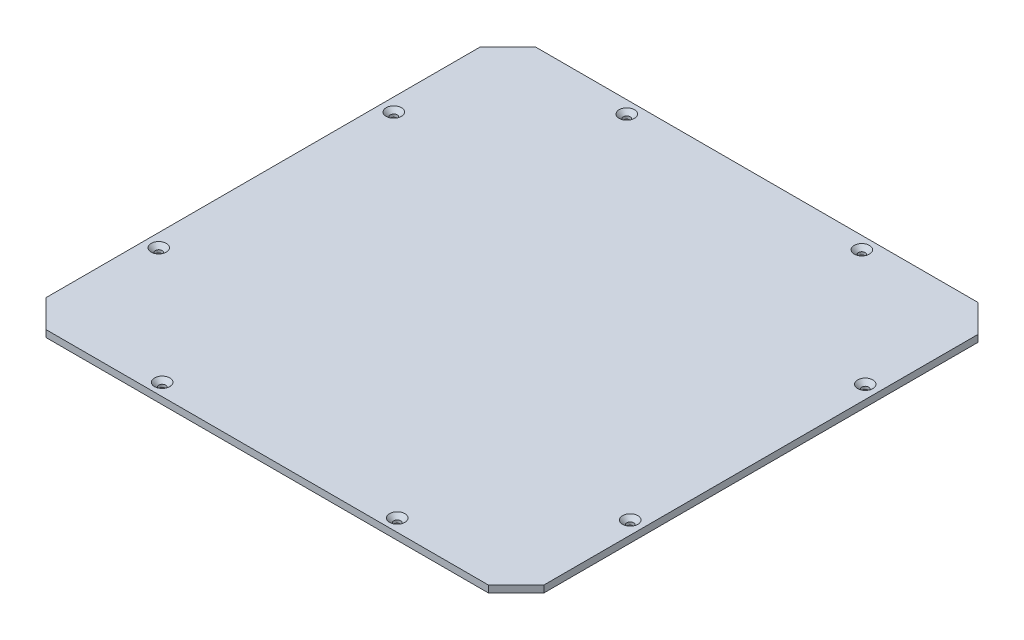
ISO-10303-21;
HEADER;
FILE_DESCRIPTION(('STEP AP214'),'2;1');
FILE_NAME('part.step','',(''),(''),'','','');
FILE_SCHEMA(('AUTOMOTIVE_DESIGN { 1 0 10303 214 1 1 1 1 }'));
ENDSEC;
DATA;
#1=APPLICATION_CONTEXT('core data for automotive mechanical design processes');
#2=APPLICATION_PROTOCOL_DEFINITION('international standard','automotive_design',2000,#1);
#3=PRODUCT_CONTEXT('',#1,'mechanical');
#4=PRODUCT('Part','Part','',(#3));
#5=PRODUCT_RELATED_PRODUCT_CATEGORY('part','',(#4));
#6=PRODUCT_DEFINITION_FORMATION('','',#4);
#7=PRODUCT_DEFINITION_CONTEXT('part definition',#1,'design');
#8=PRODUCT_DEFINITION('design','',#6,#7);
#9=PRODUCT_DEFINITION_SHAPE('','',#8);
#10=(LENGTH_UNIT() NAMED_UNIT(*) SI_UNIT(.MILLI.,.METRE.));
#11=(NAMED_UNIT(*) PLANE_ANGLE_UNIT() SI_UNIT($,.RADIAN.));
#12=(NAMED_UNIT(*) SI_UNIT($,.STERADIAN.) SOLID_ANGLE_UNIT());
#13=UNCERTAINTY_MEASURE_WITH_UNIT(LENGTH_MEASURE(1.E-05),#10,'distance_accuracy_value','');
#14=(GEOMETRIC_REPRESENTATION_CONTEXT(3) GLOBAL_UNCERTAINTY_ASSIGNED_CONTEXT((#13)) GLOBAL_UNIT_ASSIGNED_CONTEXT((#10,
#11,#12)) REPRESENTATION_CONTEXT('',''));
#15=CARTESIAN_POINT('',(0.,0.,0.));
#16=DIRECTION('',(0.,0.,1.));
#17=DIRECTION('',(1.,0.,0.));
#18=AXIS2_PLACEMENT_3D('',#15,#16,#17);
#19=CARTESIAN_POINT('',(-180.,5.,-177.));
#20=DIRECTION('',(1.,0.,0.));
#21=DIRECTION('',(0.,0.,-1.));
#22=AXIS2_PLACEMENT_3D('',#19,#20,#21);
#23=PLANE('',#22);
#24=DIRECTION('',(0.,0.,1.));
#25=VECTOR('',#24,1.);
#26=CARTESIAN_POINT('',(-180.,5.,-177.));
#27=LINE('',#26,#25);
#28=CARTESIAN_POINT('',(-180.,5.,-157.));
#29=VERTEX_POINT('',#28);
#30=CARTESIAN_POINT('',(-180.,5.,157.));
#31=VERTEX_POINT('',#30);
#32=EDGE_CURVE('E128',#29,#31,#27,.T.);
#33=ORIENTED_EDGE('',*,*,#32,.F.);
#34=DIRECTION('',(0.,-1.,0.));
#35=VECTOR('',#34,1.);
#36=CARTESIAN_POINT('',(-180.,5.,-157.));
#37=LINE('',#36,#35);
#38=CARTESIAN_POINT('',(-180.,0.,-157.));
#39=VERTEX_POINT('',#38);
#40=EDGE_CURVE('E154',#29,#39,#37,.T.);
#41=ORIENTED_EDGE('',*,*,#40,.T.);
#42=DIRECTION('',(0.,0.,1.));
#43=VECTOR('',#42,1.);
#44=CARTESIAN_POINT('',(-180.,0.,-177.));
#45=LINE('',#44,#43);
#46=CARTESIAN_POINT('',(-180.,0.,157.));
#47=VERTEX_POINT('',#46);
#48=EDGE_CURVE('E165',#39,#47,#45,.T.);
#49=ORIENTED_EDGE('',*,*,#48,.T.);
#50=DIRECTION('',(0.,1.,0.));
#51=VECTOR('',#50,1.);
#52=CARTESIAN_POINT('',(-180.,5.,157.));
#53=LINE('',#52,#51);
#54=EDGE_CURVE('E152',#47,#31,#53,.T.);
#55=ORIENTED_EDGE('',*,*,#54,.T.);
#56=EDGE_LOOP('',(#33,#41,#49,#55));
#57=FACE_BOUND('',#56,.T.);
#58=ADVANCED_FACE('F35',(#57),#23,.F.);
#59=CARTESIAN_POINT('',(180.,5.,177.));
#60=DIRECTION('',(0.,0.,-1.));
#61=DIRECTION('',(-1.,0.,0.));
#62=AXIS2_PLACEMENT_3D('',#59,#60,#61);
#63=PLANE('',#62);
#64=DIRECTION('',(1.,0.,0.));
#65=VECTOR('',#64,1.);
#66=CARTESIAN_POINT('',(180.,5.,177.));
#67=LINE('',#66,#65);
#68=CARTESIAN_POINT('',(-160.,5.,177.));
#69=VERTEX_POINT('',#68);
#70=CARTESIAN_POINT('',(160.,5.,177.));
#71=VERTEX_POINT('',#70);
#72=EDGE_CURVE('E131',#69,#71,#67,.T.);
#73=ORIENTED_EDGE('',*,*,#72,.F.);
#74=DIRECTION('',(0.,-1.,0.));
#75=VECTOR('',#74,1.);
#76=CARTESIAN_POINT('',(-160.,5.,177.));
#77=LINE('',#76,#75);
#78=CARTESIAN_POINT('',(-160.,0.,177.));
#79=VERTEX_POINT('',#78);
#80=EDGE_CURVE('E158',#69,#79,#77,.T.);
#81=ORIENTED_EDGE('',*,*,#80,.T.);
#82=DIRECTION('',(1.,0.,0.));
#83=VECTOR('',#82,1.);
#84=CARTESIAN_POINT('',(180.,0.,177.));
#85=LINE('',#84,#83);
#86=CARTESIAN_POINT('',(160.,0.,177.));
#87=VERTEX_POINT('',#86);
#88=EDGE_CURVE('E133',#79,#87,#85,.T.);
#89=ORIENTED_EDGE('',*,*,#88,.T.);
#90=DIRECTION('',(0.,1.,0.));
#91=VECTOR('',#90,1.);
#92=CARTESIAN_POINT('',(160.,5.,177.));
#93=LINE('',#92,#91);
#94=EDGE_CURVE('E50',#87,#71,#93,.T.);
#95=ORIENTED_EDGE('',*,*,#94,.T.);
#96=EDGE_LOOP('',(#73,#81,#89,#95));
#97=FACE_BOUND('',#96,.T.);
#98=ADVANCED_FACE('F247',(#97),#63,.F.);
#99=CARTESIAN_POINT('',(180.,5.,-177.));
#100=DIRECTION('',(-1.,0.,0.));
#101=DIRECTION('',(0.,0.,1.));
#102=AXIS2_PLACEMENT_3D('',#99,#100,#101);
#103=PLANE('',#102);
#104=DIRECTION('',(0.,0.,-1.));
#105=VECTOR('',#104,1.);
#106=CARTESIAN_POINT('',(180.,0.,-177.));
#107=LINE('',#106,#105);
#108=CARTESIAN_POINT('',(180.,0.,157.));
#109=VERTEX_POINT('',#108);
#110=CARTESIAN_POINT('',(180.,0.,-157.));
#111=VERTEX_POINT('',#110);
#112=EDGE_CURVE('E129',#109,#111,#107,.T.);
#113=ORIENTED_EDGE('',*,*,#112,.T.);
#114=DIRECTION('',(0.,1.,0.));
#115=VECTOR('',#114,1.);
#116=CARTESIAN_POINT('',(180.,5.,-157.));
#117=LINE('',#116,#115);
#118=CARTESIAN_POINT('',(180.,5.,-157.));
#119=VERTEX_POINT('',#118);
#120=EDGE_CURVE('E107',#111,#119,#117,.T.);
#121=ORIENTED_EDGE('',*,*,#120,.T.);
#122=DIRECTION('',(0.,0.,-1.));
#123=VECTOR('',#122,1.);
#124=CARTESIAN_POINT('',(180.,5.,-177.));
#125=LINE('',#124,#123);
#126=CARTESIAN_POINT('',(180.,5.,157.));
#127=VERTEX_POINT('',#126);
#128=EDGE_CURVE('E345',#127,#119,#125,.T.);
#129=ORIENTED_EDGE('',*,*,#128,.F.);
#130=DIRECTION('',(0.,-1.,0.));
#131=VECTOR('',#130,1.);
#132=CARTESIAN_POINT('',(180.,5.,157.));
#133=LINE('',#132,#131);
#134=EDGE_CURVE('E112',#127,#109,#133,.T.);
#135=ORIENTED_EDGE('',*,*,#134,.T.);
#136=EDGE_LOOP('',(#113,#121,#129,#135));
#137=FACE_BOUND('',#136,.T.);
#138=ADVANCED_FACE('F253',(#137),#103,.F.);
#139=CARTESIAN_POINT('',(180.,5.,-177.));
#140=DIRECTION('',(0.,0.,1.));
#141=DIRECTION('',(1.,0.,0.));
#142=AXIS2_PLACEMENT_3D('',#139,#140,#141);
#143=PLANE('',#142);
#144=DIRECTION('',(-1.,0.,0.));
#145=VECTOR('',#144,1.);
#146=CARTESIAN_POINT('',(180.,5.,-177.));
#147=LINE('',#146,#145);
#148=CARTESIAN_POINT('',(160.,5.,-177.));
#149=VERTEX_POINT('',#148);
#150=CARTESIAN_POINT('',(-160.,5.,-177.));
#151=VERTEX_POINT('',#150);
#152=EDGE_CURVE('E122',#149,#151,#147,.T.);
#153=ORIENTED_EDGE('',*,*,#152,.F.);
#154=DIRECTION('',(0.,-1.,0.));
#155=VECTOR('',#154,1.);
#156=CARTESIAN_POINT('',(160.,5.,-177.));
#157=LINE('',#156,#155);
#158=CARTESIAN_POINT('',(160.,0.,-177.));
#159=VERTEX_POINT('',#158);
#160=EDGE_CURVE('E106',#149,#159,#157,.T.);
#161=ORIENTED_EDGE('',*,*,#160,.T.);
#162=DIRECTION('',(-1.,0.,0.));
#163=VECTOR('',#162,1.);
#164=CARTESIAN_POINT('',(180.,0.,-177.));
#165=LINE('',#164,#163);
#166=CARTESIAN_POINT('',(-160.,0.,-177.));
#167=VERTEX_POINT('',#166);
#168=EDGE_CURVE('E119',#159,#167,#165,.T.);
#169=ORIENTED_EDGE('',*,*,#168,.T.);
#170=DIRECTION('',(0.,1.,0.));
#171=VECTOR('',#170,1.);
#172=CARTESIAN_POINT('',(-160.,5.,-177.));
#173=LINE('',#172,#171);
#174=EDGE_CURVE('E124',#167,#151,#173,.T.);
#175=ORIENTED_EDGE('',*,*,#174,.T.);
#176=EDGE_LOOP('',(#153,#161,#169,#175));
#177=FACE_BOUND('',#176,.T.);
#178=ADVANCED_FACE('F118',(#177),#143,.F.);
#179=CARTESIAN_POINT('',(0.,5.,0.));
#180=DIRECTION('',(0.,-1.,0.));
#181=DIRECTION('',(0.,0.,-1.));
#182=AXIS2_PLACEMENT_3D('',#179,#180,#181);
#183=PLANE('',#182);
#184=CARTESIAN_POINT('',(85.,5.,168.));
#185=DIRECTION('',(0.,-1.,0.));
#186=DIRECTION('',(0.,0.,-1.));
#187=AXIS2_PLACEMENT_3D('',#184,#185,#186);
#188=CIRCLE('',#187,5.49999999999989);
#189=CARTESIAN_POINT('',(85.,5.,162.5));
#190=VERTEX_POINT('',#189);
#191=EDGE_CURVE('E210',#190,#190,#188,.T.);
#192=ORIENTED_EDGE('',*,*,#191,.T.);
#193=EDGE_LOOP('',(#192));
#194=FACE_BOUND('',#193,.T.);
#195=CARTESIAN_POINT('',(170.5,5.,85.));
#196=DIRECTION('',(0.,-1.,0.));
#197=DIRECTION('',(0.,0.,-1.));
#198=AXIS2_PLACEMENT_3D('',#195,#196,#197);
#199=CIRCLE('',#198,5.50000000000005);
#200=CARTESIAN_POINT('',(170.5,5.,79.5));
#201=VERTEX_POINT('',#200);
#202=EDGE_CURVE('E207',#201,#201,#199,.T.);
#203=ORIENTED_EDGE('',*,*,#202,.T.);
#204=EDGE_LOOP('',(#203));
#205=FACE_BOUND('',#204,.T.);
#206=CARTESIAN_POINT('',(170.5,5.,-85.));
#207=DIRECTION('',(0.,-1.,0.));
#208=DIRECTION('',(0.,0.,-1.));
#209=AXIS2_PLACEMENT_3D('',#206,#207,#208);
#210=CIRCLE('',#209,5.50000000000005);
#211=CARTESIAN_POINT('',(170.5,5.,-90.5000000000001));
#212=VERTEX_POINT('',#211);
#213=EDGE_CURVE('E204',#212,#212,#210,.T.);
#214=ORIENTED_EDGE('',*,*,#213,.T.);
#215=EDGE_LOOP('',(#214));
#216=FACE_BOUND('',#215,.T.);
#217=CARTESIAN_POINT('',(85.,5.,-168.));
#218=DIRECTION('',(0.,-1.,0.));
#219=DIRECTION('',(0.,0.,-1.));
#220=AXIS2_PLACEMENT_3D('',#217,#218,#219);
#221=CIRCLE('',#220,5.49999999999989);
#222=CARTESIAN_POINT('',(85.,5.,-173.5));
#223=VERTEX_POINT('',#222);
#224=EDGE_CURVE('E201',#223,#223,#221,.T.);
#225=ORIENTED_EDGE('',*,*,#224,.T.);
#226=EDGE_LOOP('',(#225));
#227=FACE_BOUND('',#226,.T.);
#228=CARTESIAN_POINT('',(-85.,5.,-168.));
#229=DIRECTION('',(0.,-1.,0.));
#230=DIRECTION('',(0.,0.,-1.));
#231=AXIS2_PLACEMENT_3D('',#228,#229,#230);
#232=CIRCLE('',#231,5.49999999999989);
#233=CARTESIAN_POINT('',(-85.,5.,-173.5));
#234=VERTEX_POINT('',#233);
#235=EDGE_CURVE('E198',#234,#234,#232,.T.);
#236=ORIENTED_EDGE('',*,*,#235,.T.);
#237=EDGE_LOOP('',(#236));
#238=FACE_BOUND('',#237,.T.);
#239=CARTESIAN_POINT('',(-170.5,5.,-85.));
#240=DIRECTION('',(0.,-1.,0.));
#241=DIRECTION('',(0.,0.,-1.));
#242=AXIS2_PLACEMENT_3D('',#239,#240,#241);
#243=CIRCLE('',#242,5.50000000000005);
#244=CARTESIAN_POINT('',(-170.5,5.,-90.5000000000001));
#245=VERTEX_POINT('',#244);
#246=EDGE_CURVE('E195',#245,#245,#243,.T.);
#247=ORIENTED_EDGE('',*,*,#246,.T.);
#248=EDGE_LOOP('',(#247));
#249=FACE_BOUND('',#248,.T.);
#250=CARTESIAN_POINT('',(-170.5,5.,85.));
#251=DIRECTION('',(0.,-1.,0.));
#252=DIRECTION('',(0.,0.,-1.));
#253=AXIS2_PLACEMENT_3D('',#250,#251,#252);
#254=CIRCLE('',#253,5.50000000000005);
#255=CARTESIAN_POINT('',(-170.5,5.,79.5));
#256=VERTEX_POINT('',#255);
#257=EDGE_CURVE('E192',#256,#256,#254,.T.);
#258=ORIENTED_EDGE('',*,*,#257,.T.);
#259=EDGE_LOOP('',(#258));
#260=FACE_BOUND('',#259,.T.);
#261=CARTESIAN_POINT('',(-85.,5.,168.));
#262=DIRECTION('',(0.,-1.,0.));
#263=DIRECTION('',(0.,0.,-1.));
#264=AXIS2_PLACEMENT_3D('',#261,#262,#263);
#265=CIRCLE('',#264,5.49999999999989);
#266=CARTESIAN_POINT('',(-85.,5.,162.5));
#267=VERTEX_POINT('',#266);
#268=EDGE_CURVE('E189',#267,#267,#265,.T.);
#269=ORIENTED_EDGE('',*,*,#268,.T.);
#270=EDGE_LOOP('',(#269));
#271=FACE_BOUND('',#270,.T.);
#272=ORIENTED_EDGE('',*,*,#128,.T.);
#273=DIRECTION('',(0.707106781186548,0.,0.707106781186548));
#274=VECTOR('',#273,1.);
#275=CARTESIAN_POINT('',(160.,5.,-177.));
#276=LINE('',#275,#274);
#277=EDGE_CURVE('E150',#119,#149,#276,.F.);
#278=ORIENTED_EDGE('',*,*,#277,.T.);
#279=ORIENTED_EDGE('',*,*,#152,.T.);
#280=DIRECTION('',(0.707106781186548,0.,-0.707106781186548));
#281=VECTOR('',#280,1.);
#282=CARTESIAN_POINT('',(-180.,5.,-157.));
#283=LINE('',#282,#281);
#284=EDGE_CURVE('E148',#151,#29,#283,.F.);
#285=ORIENTED_EDGE('',*,*,#284,.T.);
#286=ORIENTED_EDGE('',*,*,#32,.T.);
#287=DIRECTION('',(-0.707106781186546,0.,-0.707106781186549));
#288=VECTOR('',#287,1.);
#289=CARTESIAN_POINT('',(-160.,5.,177.));
#290=LINE('',#289,#288);
#291=EDGE_CURVE('E57',#31,#69,#290,.F.);
#292=ORIENTED_EDGE('',*,*,#291,.T.);
#293=ORIENTED_EDGE('',*,*,#72,.T.);
#294=DIRECTION('',(-0.707106781186548,0.,0.707106781186547));
#295=VECTOR('',#294,1.);
#296=CARTESIAN_POINT('',(180.,5.,157.));
#297=LINE('',#296,#295);
#298=EDGE_CURVE('E145',#71,#127,#297,.F.);
#299=ORIENTED_EDGE('',*,*,#298,.T.);
#300=EDGE_LOOP('',(#272,#278,#279,#285,#286,#292,#293,#299));
#301=FACE_BOUND('',#300,.T.);
#302=ADVANCED_FACE('F308',(#194,#205,#216,#227,#238,#249,#260,#271,#301),#183,.F.);
#303=CARTESIAN_POINT('',(0.,0.,0.));
#304=DIRECTION('',(0.,-1.,0.));
#305=DIRECTION('',(0.,0.,-1.));
#306=AXIS2_PLACEMENT_3D('',#303,#304,#305);
#307=PLANE('',#306);
#308=CARTESIAN_POINT('',(170.5,0.,85.));
#309=DIRECTION('',(0.,-1.,0.));
#310=DIRECTION('',(0.,0.,-1.));
#311=AXIS2_PLACEMENT_3D('',#308,#309,#310);
#312=CIRCLE('',#311,2.5);
#313=CARTESIAN_POINT('',(170.5,0.,82.5));
#314=VERTEX_POINT('',#313);
#315=EDGE_CURVE('E166',#314,#314,#312,.T.);
#316=ORIENTED_EDGE('',*,*,#315,.F.);
#317=EDGE_LOOP('',(#316));
#318=FACE_BOUND('',#317,.T.);
#319=CARTESIAN_POINT('',(170.5,0.,-85.));
#320=DIRECTION('',(0.,-1.,0.));
#321=DIRECTION('',(0.,0.,-1.));
#322=AXIS2_PLACEMENT_3D('',#319,#320,#321);
#323=CIRCLE('',#322,2.5);
#324=CARTESIAN_POINT('',(170.5,0.,-87.5));
#325=VERTEX_POINT('',#324);
#326=EDGE_CURVE('E182',#325,#325,#323,.T.);
#327=ORIENTED_EDGE('',*,*,#326,.F.);
#328=EDGE_LOOP('',(#327));
#329=FACE_BOUND('',#328,.T.);
#330=CARTESIAN_POINT('',(85.,0.,-168.));
#331=DIRECTION('',(0.,-1.,0.));
#332=DIRECTION('',(0.,0.,-1.));
#333=AXIS2_PLACEMENT_3D('',#330,#331,#332);
#334=CIRCLE('',#333,2.50000000000001);
#335=CARTESIAN_POINT('',(85.,0.,-170.5));
#336=VERTEX_POINT('',#335);
#337=EDGE_CURVE('E179',#336,#336,#334,.T.);
#338=ORIENTED_EDGE('',*,*,#337,.F.);
#339=EDGE_LOOP('',(#338));
#340=FACE_BOUND('',#339,.T.);
#341=CARTESIAN_POINT('',(-85.,0.,-168.));
#342=DIRECTION('',(0.,-1.,0.));
#343=DIRECTION('',(0.,0.,-1.));
#344=AXIS2_PLACEMENT_3D('',#341,#342,#343);
#345=CIRCLE('',#344,2.50000000000001);
#346=CARTESIAN_POINT('',(-85.,0.,-170.5));
#347=VERTEX_POINT('',#346);
#348=EDGE_CURVE('E176',#347,#347,#345,.T.);
#349=ORIENTED_EDGE('',*,*,#348,.F.);
#350=EDGE_LOOP('',(#349));
#351=FACE_BOUND('',#350,.T.);
#352=CARTESIAN_POINT('',(-170.5,0.,-85.));
#353=DIRECTION('',(0.,-1.,0.));
#354=DIRECTION('',(0.,0.,-1.));
#355=AXIS2_PLACEMENT_3D('',#352,#353,#354);
#356=CIRCLE('',#355,2.5);
#357=CARTESIAN_POINT('',(-170.5,0.,-87.5));
#358=VERTEX_POINT('',#357);
#359=EDGE_CURVE('E173',#358,#358,#356,.T.);
#360=ORIENTED_EDGE('',*,*,#359,.F.);
#361=EDGE_LOOP('',(#360));
#362=FACE_BOUND('',#361,.T.);
#363=CARTESIAN_POINT('',(-170.5,0.,85.));
#364=DIRECTION('',(0.,-1.,0.));
#365=DIRECTION('',(0.,0.,-1.));
#366=AXIS2_PLACEMENT_3D('',#363,#364,#365);
#367=CIRCLE('',#366,2.5);
#368=CARTESIAN_POINT('',(-170.5,0.,82.5));
#369=VERTEX_POINT('',#368);
#370=EDGE_CURVE('E170',#369,#369,#367,.T.);
#371=ORIENTED_EDGE('',*,*,#370,.F.);
#372=EDGE_LOOP('',(#371));
#373=FACE_BOUND('',#372,.T.);
#374=CARTESIAN_POINT('',(-85.,0.,168.));
#375=DIRECTION('',(0.,-1.,0.));
#376=DIRECTION('',(0.,0.,-1.));
#377=AXIS2_PLACEMENT_3D('',#374,#375,#376);
#378=CIRCLE('',#377,2.5);
#379=CARTESIAN_POINT('',(-85.,0.,165.5));
#380=VERTEX_POINT('',#379);
#381=EDGE_CURVE('E167',#380,#380,#378,.T.);
#382=ORIENTED_EDGE('',*,*,#381,.F.);
#383=EDGE_LOOP('',(#382));
#384=FACE_BOUND('',#383,.T.);
#385=CARTESIAN_POINT('',(85.,0.,168.));
#386=DIRECTION('',(0.,-1.,0.));
#387=DIRECTION('',(0.,0.,-1.));
#388=AXIS2_PLACEMENT_3D('',#385,#386,#387);
#389=CIRCLE('',#388,2.5);
#390=CARTESIAN_POINT('',(85.,0.,165.5));
#391=VERTEX_POINT('',#390);
#392=EDGE_CURVE('E162',#391,#391,#389,.T.);
#393=ORIENTED_EDGE('',*,*,#392,.F.);
#394=EDGE_LOOP('',(#393));
#395=FACE_BOUND('',#394,.T.);
#396=ORIENTED_EDGE('',*,*,#168,.F.);
#397=DIRECTION('',(-0.707106781186548,0.,-0.707106781186548));
#398=VECTOR('',#397,1.);
#399=CARTESIAN_POINT('',(168.5,0.,-168.5));
#400=LINE('',#399,#398);
#401=EDGE_CURVE('E102',#159,#111,#400,.F.);
#402=ORIENTED_EDGE('',*,*,#401,.T.);
#403=ORIENTED_EDGE('',*,*,#112,.F.);
#404=DIRECTION('',(0.707106781186548,0.,-0.707106781186547));
#405=VECTOR('',#404,1.);
#406=CARTESIAN_POINT('',(168.5,0.,168.5));
#407=LINE('',#406,#405);
#408=EDGE_CURVE('E123',#109,#87,#407,.F.);
#409=ORIENTED_EDGE('',*,*,#408,.T.);
#410=ORIENTED_EDGE('',*,*,#88,.F.);
#411=DIRECTION('',(0.707106781186546,0.,0.707106781186549));
#412=VECTOR('',#411,1.);
#413=CARTESIAN_POINT('',(-168.5,0.,168.5));
#414=LINE('',#413,#412);
#415=EDGE_CURVE('E139',#79,#47,#414,.F.);
#416=ORIENTED_EDGE('',*,*,#415,.T.);
#417=ORIENTED_EDGE('',*,*,#48,.F.);
#418=DIRECTION('',(-0.707106781186548,0.,0.707106781186548));
#419=VECTOR('',#418,1.);
#420=CARTESIAN_POINT('',(-168.5,0.,-168.5));
#421=LINE('',#420,#419);
#422=EDGE_CURVE('E113',#39,#167,#421,.F.);
#423=ORIENTED_EDGE('',*,*,#422,.T.);
#424=EDGE_LOOP('',(#396,#402,#403,#409,#410,#416,#417,#423));
#425=FACE_BOUND('',#424,.T.);
#426=ADVANCED_FACE('F126',(#318,#329,#340,#351,#362,#373,#384,#395,#425),#307,.T.);
#427=CARTESIAN_POINT('',(160.,5.,-177.));
#428=DIRECTION('',(-0.707106781186547,0.,0.707106781186547));
#429=DIRECTION('',(0.,-1.,0.));
#430=AXIS2_PLACEMENT_3D('',#427,#428,#429);
#431=PLANE('',#430);
#432=ORIENTED_EDGE('',*,*,#277,.F.);
#433=ORIENTED_EDGE('',*,*,#120,.F.);
#434=ORIENTED_EDGE('',*,*,#401,.F.);
#435=ORIENTED_EDGE('',*,*,#160,.F.);
#436=EDGE_LOOP('',(#432,#433,#434,#435));
#437=FACE_BOUND('',#436,.T.);
#438=ADVANCED_FACE('F105',(#437),#431,.F.);
#439=CARTESIAN_POINT('',(-180.,5.,-157.));
#440=DIRECTION('',(0.707106781186547,0.,0.707106781186547));
#441=DIRECTION('',(0.,-1.,0.));
#442=AXIS2_PLACEMENT_3D('',#439,#440,#441);
#443=PLANE('',#442);
#444=ORIENTED_EDGE('',*,*,#284,.F.);
#445=ORIENTED_EDGE('',*,*,#174,.F.);
#446=ORIENTED_EDGE('',*,*,#422,.F.);
#447=ORIENTED_EDGE('',*,*,#40,.F.);
#448=EDGE_LOOP('',(#444,#445,#446,#447));
#449=FACE_BOUND('',#448,.T.);
#450=ADVANCED_FACE('F260',(#449),#443,.F.);
#451=CARTESIAN_POINT('',(-160.,5.,177.));
#452=DIRECTION('',(0.707106781186549,0.,-0.707106781186546));
#453=DIRECTION('',(0.,-1.,0.));
#454=AXIS2_PLACEMENT_3D('',#451,#452,#453);
#455=PLANE('',#454);
#456=ORIENTED_EDGE('',*,*,#291,.F.);
#457=ORIENTED_EDGE('',*,*,#54,.F.);
#458=ORIENTED_EDGE('',*,*,#415,.F.);
#459=ORIENTED_EDGE('',*,*,#80,.F.);
#460=EDGE_LOOP('',(#456,#457,#458,#459));
#461=FACE_BOUND('',#460,.T.);
#462=ADVANCED_FACE('F263',(#461),#455,.F.);
#463=CARTESIAN_POINT('',(180.,5.,157.));
#464=DIRECTION('',(-0.707106781186547,0.,-0.707106781186548));
#465=DIRECTION('',(0.,-1.,0.));
#466=AXIS2_PLACEMENT_3D('',#463,#464,#465);
#467=PLANE('',#466);
#468=ORIENTED_EDGE('',*,*,#298,.F.);
#469=ORIENTED_EDGE('',*,*,#94,.F.);
#470=ORIENTED_EDGE('',*,*,#408,.F.);
#471=ORIENTED_EDGE('',*,*,#134,.F.);
#472=EDGE_LOOP('',(#468,#469,#470,#471));
#473=FACE_BOUND('',#472,.T.);
#474=ADVANCED_FACE('F267',(#473),#467,.F.);
#475=CARTESIAN_POINT('',(85.,-5.,168.));
#476=DIRECTION('',(0.,1.,0.));
#477=DIRECTION('',(0.,0.,1.));
#478=AXIS2_PLACEMENT_3D('',#475,#476,#477);
#479=CYLINDRICAL_SURFACE('',#478,2.5);
#480=CARTESIAN_POINT('',(85.,2.00000000000009,168.));
#481=DIRECTION('',(0.,-1.,0.));
#482=DIRECTION('',(0.,0.,-1.));
#483=AXIS2_PLACEMENT_3D('',#480,#481,#482);
#484=CIRCLE('',#483,2.5);
#485=CARTESIAN_POINT('',(85.,2.00000000000009,165.5));
#486=VERTEX_POINT('',#485);
#487=EDGE_CURVE('E161',#486,#486,#484,.F.);
#488=ORIENTED_EDGE('',*,*,#487,.T.);
#489=EDGE_LOOP('',(#488));
#490=FACE_BOUND('',#489,.T.);
#491=ORIENTED_EDGE('',*,*,#392,.T.);
#492=EDGE_LOOP('',(#491));
#493=FACE_BOUND('',#492,.T.);
#494=ADVANCED_FACE('F271',(#490,#493),#479,.F.);
#495=CARTESIAN_POINT('',(-85.,-5.,168.));
#496=DIRECTION('',(0.,1.,0.));
#497=DIRECTION('',(0.,0.,1.));
#498=AXIS2_PLACEMENT_3D('',#495,#496,#497);
#499=CYLINDRICAL_SURFACE('',#498,2.5);
#500=CARTESIAN_POINT('',(-85.,2.00000000000009,168.));
#501=DIRECTION('',(0.,-1.,0.));
#502=DIRECTION('',(0.,0.,-1.));
#503=AXIS2_PLACEMENT_3D('',#500,#501,#502);
#504=CIRCLE('',#503,2.5);
#505=CARTESIAN_POINT('',(-85.,2.00000000000009,165.5));
#506=VERTEX_POINT('',#505);
#507=EDGE_CURVE('E11',#506,#506,#504,.F.);
#508=ORIENTED_EDGE('',*,*,#507,.T.);
#509=EDGE_LOOP('',(#508));
#510=FACE_BOUND('',#509,.T.);
#511=ORIENTED_EDGE('',*,*,#381,.T.);
#512=EDGE_LOOP('',(#511));
#513=FACE_BOUND('',#512,.T.);
#514=ADVANCED_FACE('F320',(#510,#513),#499,.F.);
#515=CARTESIAN_POINT('',(-170.5,-5.,85.));
#516=DIRECTION('',(0.,1.,0.));
#517=DIRECTION('',(0.,0.,1.));
#518=AXIS2_PLACEMENT_3D('',#515,#516,#517);
#519=CYLINDRICAL_SURFACE('',#518,2.5);
#520=CARTESIAN_POINT('',(-170.5,1.99999999999993,85.));
#521=DIRECTION('',(0.,-1.,0.));
#522=DIRECTION('',(0.,0.,-1.));
#523=AXIS2_PLACEMENT_3D('',#520,#521,#522);
#524=CIRCLE('',#523,2.5);
#525=CARTESIAN_POINT('',(-170.5,1.99999999999993,82.5));
#526=VERTEX_POINT('',#525);
#527=EDGE_CURVE('E43',#526,#526,#524,.F.);
#528=ORIENTED_EDGE('',*,*,#527,.T.);
#529=EDGE_LOOP('',(#528));
#530=FACE_BOUND('',#529,.T.);
#531=ORIENTED_EDGE('',*,*,#370,.T.);
#532=EDGE_LOOP('',(#531));
#533=FACE_BOUND('',#532,.T.);
#534=ADVANCED_FACE('F230',(#530,#533),#519,.F.);
#535=CARTESIAN_POINT('',(-170.5,-5.,-85.));
#536=DIRECTION('',(0.,1.,0.));
#537=DIRECTION('',(0.,0.,1.));
#538=AXIS2_PLACEMENT_3D('',#535,#536,#537);
#539=CYLINDRICAL_SURFACE('',#538,2.5);
#540=CARTESIAN_POINT('',(-170.5,1.99999999999993,-85.));
#541=DIRECTION('',(0.,-1.,0.));
#542=DIRECTION('',(0.,0.,-1.));
#543=AXIS2_PLACEMENT_3D('',#540,#541,#542);
#544=CIRCLE('',#543,2.5);
#545=CARTESIAN_POINT('',(-170.5,1.99999999999993,-87.5));
#546=VERTEX_POINT('',#545);
#547=EDGE_CURVE('E225',#546,#546,#544,.F.);
#548=ORIENTED_EDGE('',*,*,#547,.T.);
#549=EDGE_LOOP('',(#548));
#550=FACE_BOUND('',#549,.T.);
#551=ORIENTED_EDGE('',*,*,#359,.T.);
#552=EDGE_LOOP('',(#551));
#553=FACE_BOUND('',#552,.T.);
#554=ADVANCED_FACE('F302',(#550,#553),#539,.F.);
#555=CARTESIAN_POINT('',(-85.,-5.,-168.));
#556=DIRECTION('',(0.,1.,0.));
#557=DIRECTION('',(0.,0.,1.));
#558=AXIS2_PLACEMENT_3D('',#555,#556,#557);
#559=CYLINDRICAL_SURFACE('',#558,2.50000000000001);
#560=CARTESIAN_POINT('',(-85.,2.00000000000011,-168.));
#561=DIRECTION('',(0.,-1.,0.));
#562=DIRECTION('',(0.,0.,-1.));
#563=AXIS2_PLACEMENT_3D('',#560,#561,#562);
#564=CIRCLE('',#563,2.50000000000001);
#565=CARTESIAN_POINT('',(-85.,2.00000000000011,-170.5));
#566=VERTEX_POINT('',#565);
#567=EDGE_CURVE('E222',#566,#566,#564,.F.);
#568=ORIENTED_EDGE('',*,*,#567,.T.);
#569=EDGE_LOOP('',(#568));
#570=FACE_BOUND('',#569,.T.);
#571=ORIENTED_EDGE('',*,*,#348,.T.);
#572=EDGE_LOOP('',(#571));
#573=FACE_BOUND('',#572,.T.);
#574=ADVANCED_FACE('F298',(#570,#573),#559,.F.);
#575=CARTESIAN_POINT('',(85.,-5.,-168.));
#576=DIRECTION('',(0.,1.,0.));
#577=DIRECTION('',(0.,0.,1.));
#578=AXIS2_PLACEMENT_3D('',#575,#576,#577);
#579=CYLINDRICAL_SURFACE('',#578,2.50000000000001);
#580=CARTESIAN_POINT('',(85.,2.00000000000011,-168.));
#581=DIRECTION('',(0.,-1.,0.));
#582=DIRECTION('',(0.,0.,-1.));
#583=AXIS2_PLACEMENT_3D('',#580,#581,#582);
#584=CIRCLE('',#583,2.50000000000001);
#585=CARTESIAN_POINT('',(85.,2.00000000000011,-170.5));
#586=VERTEX_POINT('',#585);
#587=EDGE_CURVE('E219',#586,#586,#584,.F.);
#588=ORIENTED_EDGE('',*,*,#587,.T.);
#589=EDGE_LOOP('',(#588));
#590=FACE_BOUND('',#589,.T.);
#591=ORIENTED_EDGE('',*,*,#337,.T.);
#592=EDGE_LOOP('',(#591));
#593=FACE_BOUND('',#592,.T.);
#594=ADVANCED_FACE('F301',(#590,#593),#579,.F.);
#595=CARTESIAN_POINT('',(170.5,-5.,-85.));
#596=DIRECTION('',(0.,1.,0.));
#597=DIRECTION('',(0.,0.,1.));
#598=AXIS2_PLACEMENT_3D('',#595,#596,#597);
#599=CYLINDRICAL_SURFACE('',#598,2.5);
#600=CARTESIAN_POINT('',(170.5,1.99999999999993,-85.));
#601=DIRECTION('',(0.,-1.,0.));
#602=DIRECTION('',(0.,0.,-1.));
#603=AXIS2_PLACEMENT_3D('',#600,#601,#602);
#604=CIRCLE('',#603,2.5);
#605=CARTESIAN_POINT('',(170.5,1.99999999999993,-87.5));
#606=VERTEX_POINT('',#605);
#607=EDGE_CURVE('E216',#606,#606,#604,.F.);
#608=ORIENTED_EDGE('',*,*,#607,.T.);
#609=EDGE_LOOP('',(#608));
#610=FACE_BOUND('',#609,.T.);
#611=ORIENTED_EDGE('',*,*,#326,.T.);
#612=EDGE_LOOP('',(#611));
#613=FACE_BOUND('',#612,.T.);
#614=ADVANCED_FACE('F423',(#610,#613),#599,.F.);
#615=CARTESIAN_POINT('',(170.5,-5.,85.));
#616=DIRECTION('',(0.,1.,0.));
#617=DIRECTION('',(0.,0.,1.));
#618=AXIS2_PLACEMENT_3D('',#615,#616,#617);
#619=CYLINDRICAL_SURFACE('',#618,2.5);
#620=CARTESIAN_POINT('',(170.5,1.99999999999993,85.));
#621=DIRECTION('',(0.,-1.,0.));
#622=DIRECTION('',(0.,0.,-1.));
#623=AXIS2_PLACEMENT_3D('',#620,#621,#622);
#624=CIRCLE('',#623,2.5);
#625=CARTESIAN_POINT('',(170.5,1.99999999999993,82.5));
#626=VERTEX_POINT('',#625);
#627=EDGE_CURVE('E213',#626,#626,#624,.F.);
#628=ORIENTED_EDGE('',*,*,#627,.T.);
#629=EDGE_LOOP('',(#628));
#630=FACE_BOUND('',#629,.T.);
#631=ORIENTED_EDGE('',*,*,#315,.T.);
#632=EDGE_LOOP('',(#631));
#633=FACE_BOUND('',#632,.T.);
#634=ADVANCED_FACE('F277',(#630,#633),#619,.F.);
#635=CARTESIAN_POINT('',(85.,2.00000000000009,168.));
#636=DIRECTION('',(0.,1.,0.));
#637=DIRECTION('',(0.,0.,1.));
#638=AXIS2_PLACEMENT_3D('',#635,#636,#637);
#639=CONICAL_SURFACE('',#638,2.5,0.785398163397447);
#640=ORIENTED_EDGE('',*,*,#191,.F.);
#641=EDGE_LOOP('',(#640));
#642=FACE_BOUND('',#641,.T.);
#643=ORIENTED_EDGE('',*,*,#487,.F.);
#644=EDGE_LOOP('',(#643));
#645=FACE_BOUND('',#644,.T.);
#646=ADVANCED_FACE('F273',(#642,#645),#639,.F.);
#647=CARTESIAN_POINT('',(170.5,1.99999999999993,85.));
#648=DIRECTION('',(0.,1.,0.));
#649=DIRECTION('',(0.,0.,1.));
#650=AXIS2_PLACEMENT_3D('',#647,#648,#649);
#651=CONICAL_SURFACE('',#650,2.5,0.785398163397445);
#652=ORIENTED_EDGE('',*,*,#202,.F.);
#653=EDGE_LOOP('',(#652));
#654=FACE_BOUND('',#653,.T.);
#655=ORIENTED_EDGE('',*,*,#627,.F.);
#656=EDGE_LOOP('',(#655));
#657=FACE_BOUND('',#656,.T.);
#658=ADVANCED_FACE('F276',(#654,#657),#651,.F.);
#659=CARTESIAN_POINT('',(170.5,1.99999999999993,-85.));
#660=DIRECTION('',(0.,1.,0.));
#661=DIRECTION('',(0.,0.,1.));
#662=AXIS2_PLACEMENT_3D('',#659,#660,#661);
#663=CONICAL_SURFACE('',#662,2.5,0.785398163397445);
#664=ORIENTED_EDGE('',*,*,#213,.F.);
#665=EDGE_LOOP('',(#664));
#666=FACE_BOUND('',#665,.T.);
#667=ORIENTED_EDGE('',*,*,#607,.F.);
#668=EDGE_LOOP('',(#667));
#669=FACE_BOUND('',#668,.T.);
#670=ADVANCED_FACE('F281',(#666,#669),#663,.F.);
#671=CARTESIAN_POINT('',(85.,2.00000000000011,-168.));
#672=DIRECTION('',(0.,1.,0.));
#673=DIRECTION('',(0.,0.,1.));
#674=AXIS2_PLACEMENT_3D('',#671,#672,#673);
#675=CONICAL_SURFACE('',#674,2.50000000000001,0.785398163397447);
#676=ORIENTED_EDGE('',*,*,#224,.F.);
#677=EDGE_LOOP('',(#676));
#678=FACE_BOUND('',#677,.T.);
#679=ORIENTED_EDGE('',*,*,#587,.F.);
#680=EDGE_LOOP('',(#679));
#681=FACE_BOUND('',#680,.T.);
#682=ADVANCED_FACE('F285',(#678,#681),#675,.F.);
#683=CARTESIAN_POINT('',(-85.,2.00000000000011,-168.));
#684=DIRECTION('',(0.,1.,0.));
#685=DIRECTION('',(0.,0.,1.));
#686=AXIS2_PLACEMENT_3D('',#683,#684,#685);
#687=CONICAL_SURFACE('',#686,2.50000000000001,0.785398163397447);
#688=ORIENTED_EDGE('',*,*,#235,.F.);
#689=EDGE_LOOP('',(#688));
#690=FACE_BOUND('',#689,.T.);
#691=ORIENTED_EDGE('',*,*,#567,.F.);
#692=EDGE_LOOP('',(#691));
#693=FACE_BOUND('',#692,.T.);
#694=ADVANCED_FACE('F242',(#690,#693),#687,.F.);
#695=CARTESIAN_POINT('',(-170.5,1.99999999999993,-85.));
#696=DIRECTION('',(0.,1.,0.));
#697=DIRECTION('',(0.,0.,1.));
#698=AXIS2_PLACEMENT_3D('',#695,#696,#697);
#699=CONICAL_SURFACE('',#698,2.5,0.785398163397445);
#700=ORIENTED_EDGE('',*,*,#246,.F.);
#701=EDGE_LOOP('',(#700));
#702=FACE_BOUND('',#701,.T.);
#703=ORIENTED_EDGE('',*,*,#547,.F.);
#704=EDGE_LOOP('',(#703));
#705=FACE_BOUND('',#704,.T.);
#706=ADVANCED_FACE('F235',(#702,#705),#699,.F.);
#707=CARTESIAN_POINT('',(-170.5,1.99999999999993,85.));
#708=DIRECTION('',(0.,1.,0.));
#709=DIRECTION('',(0.,0.,1.));
#710=AXIS2_PLACEMENT_3D('',#707,#708,#709);
#711=CONICAL_SURFACE('',#710,2.5,0.785398163397445);
#712=ORIENTED_EDGE('',*,*,#257,.F.);
#713=EDGE_LOOP('',(#712));
#714=FACE_BOUND('',#713,.T.);
#715=ORIENTED_EDGE('',*,*,#527,.F.);
#716=EDGE_LOOP('',(#715));
#717=FACE_BOUND('',#716,.T.);
#718=ADVANCED_FACE('F233',(#714,#717),#711,.F.);
#719=CARTESIAN_POINT('',(-85.,2.00000000000009,168.));
#720=DIRECTION('',(0.,1.,0.));
#721=DIRECTION('',(0.,0.,1.));
#722=AXIS2_PLACEMENT_3D('',#719,#720,#721);
#723=CONICAL_SURFACE('',#722,2.5,0.785398163397447);
#724=ORIENTED_EDGE('',*,*,#268,.F.);
#725=EDGE_LOOP('',(#724));
#726=FACE_BOUND('',#725,.T.);
#727=ORIENTED_EDGE('',*,*,#507,.F.);
#728=EDGE_LOOP('',(#727));
#729=FACE_BOUND('',#728,.T.);
#730=ADVANCED_FACE('F37',(#726,#729),#723,.F.);
#731=CLOSED_SHELL('',(#58,#98,#138,#178,#302,#426,#438,#450,#462,#474,#494,#514,#534,#554,#574,
#594,#614,#634,#646,#658,#670,#682,#694,#706,#718,#730));
#732=MANIFOLD_SOLID_BREP('B2',#731);
#733=ADVANCED_BREP_SHAPE_REPRESENTATION('',(#18,#732),#14);
#734=SHAPE_DEFINITION_REPRESENTATION(#9,#733);
ENDSEC;
END-ISO-10303-21;
